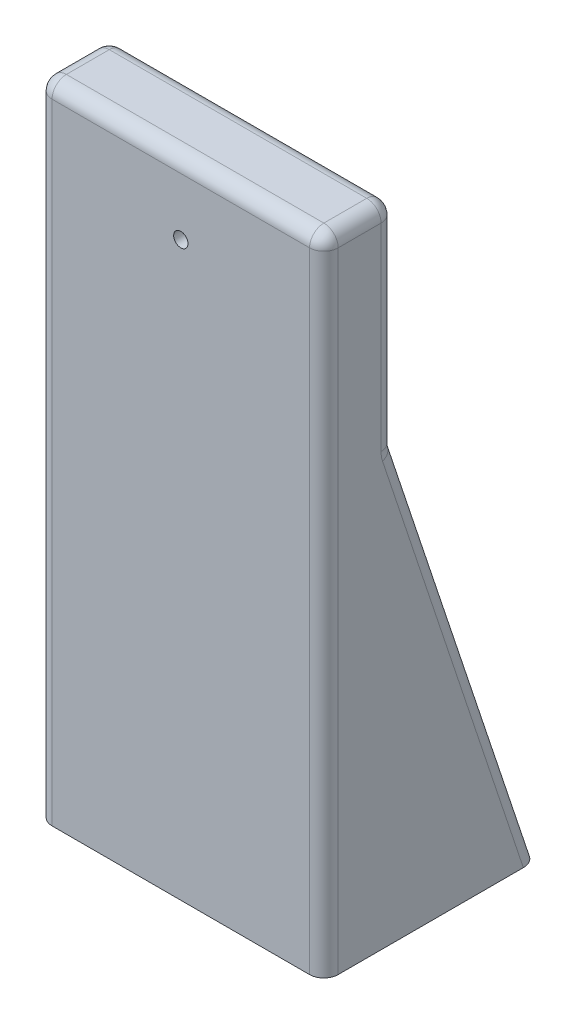
ISO-10303-21;
HEADER;
FILE_DESCRIPTION(('STEP AP214'),'2;1');
FILE_NAME('part.step','',(''),(''),'','','');
FILE_SCHEMA(('AUTOMOTIVE_DESIGN { 1 0 10303 214 1 1 1 1 }'));
ENDSEC;
DATA;
#1=APPLICATION_CONTEXT('core data for automotive mechanical design processes');
#2=APPLICATION_PROTOCOL_DEFINITION('international standard','automotive_design',2000,#1);
#3=PRODUCT_CONTEXT('',#1,'mechanical');
#4=PRODUCT('Part','Part','',(#3));
#5=PRODUCT_RELATED_PRODUCT_CATEGORY('part','',(#4));
#6=PRODUCT_DEFINITION_FORMATION('','',#4);
#7=PRODUCT_DEFINITION_CONTEXT('part definition',#1,'design');
#8=PRODUCT_DEFINITION('design','',#6,#7);
#9=PRODUCT_DEFINITION_SHAPE('','',#8);
#10=(LENGTH_UNIT() NAMED_UNIT(*) SI_UNIT(.MILLI.,.METRE.));
#11=(NAMED_UNIT(*) PLANE_ANGLE_UNIT() SI_UNIT($,.RADIAN.));
#12=(NAMED_UNIT(*) SI_UNIT($,.STERADIAN.) SOLID_ANGLE_UNIT());
#13=UNCERTAINTY_MEASURE_WITH_UNIT(LENGTH_MEASURE(1.E-05),#10,'distance_accuracy_value','');
#14=(GEOMETRIC_REPRESENTATION_CONTEXT(3) GLOBAL_UNCERTAINTY_ASSIGNED_CONTEXT((#13)) GLOBAL_UNIT_ASSIGNED_CONTEXT((#10,
#11,#12)) REPRESENTATION_CONTEXT('',''));
#15=CARTESIAN_POINT('',(0.,0.,0.));
#16=DIRECTION('',(0.,0.,1.));
#17=DIRECTION('',(1.,0.,0.));
#18=AXIS2_PLACEMENT_3D('',#15,#16,#17);
#19=CARTESIAN_POINT('',(0.,0.,6.35));
#20=DIRECTION('',(0.,0.,-1.));
#21=DIRECTION('',(-1.,0.,0.));
#22=AXIS2_PLACEMENT_3D('',#19,#20,#21);
#23=PLANE('',#22);
#24=DIRECTION('',(-1.,0.,0.));
#25=VECTOR('',#24,1.);
#26=CARTESIAN_POINT('',(0.,54.61,6.35));
#27=LINE('',#26,#25);
#28=CARTESIAN_POINT('',(22.86,54.61,6.35));
#29=VERTEX_POINT('',#28);
#30=CARTESIAN_POINT('',(-22.86,54.61,6.35));
#31=VERTEX_POINT('',#30);
#32=EDGE_CURVE('E228',#29,#31,#27,.T.);
#33=ORIENTED_EDGE('',*,*,#32,.T.);
#34=DIRECTION('',(0.,-1.,0.));
#35=VECTOR('',#34,1.);
#36=CARTESIAN_POINT('',(-22.86,0.,6.35));
#37=LINE('',#36,#35);
#38=CARTESIAN_POINT('',(-22.86,-57.15,6.35));
#39=VERTEX_POINT('',#38);
#40=EDGE_CURVE('E231',#31,#39,#37,.T.);
#41=ORIENTED_EDGE('',*,*,#40,.T.);
#42=DIRECTION('',(1.,0.,0.));
#43=VECTOR('',#42,1.);
#44=CARTESIAN_POINT('',(-25.4,-57.15,6.35));
#45=LINE('',#44,#43);
#46=CARTESIAN_POINT('',(22.86,-57.15,6.35));
#47=VERTEX_POINT('',#46);
#48=EDGE_CURVE('E360',#39,#47,#45,.T.);
#49=ORIENTED_EDGE('',*,*,#48,.T.);
#50=DIRECTION('',(0.,1.,0.));
#51=VECTOR('',#50,1.);
#52=CARTESIAN_POINT('',(22.86,0.,6.35));
#53=LINE('',#52,#51);
#54=EDGE_CURVE('E225',#47,#29,#53,.T.);
#55=ORIENTED_EDGE('',*,*,#54,.T.);
#56=EDGE_LOOP('',(#33,#41,#49,#55));
#57=FACE_BOUND('',#56,.T.);
#58=CARTESIAN_POINT('',(0.,44.45,6.35));
#59=DIRECTION('',(0.,0.,1.));
#60=DIRECTION('',(1.,0.,0.));
#61=AXIS2_PLACEMENT_3D('',#58,#59,#60);
#62=CIRCLE('',#61,1.27);
#63=CARTESIAN_POINT('',(1.27,44.45,6.35));
#64=VERTEX_POINT('',#63);
#65=EDGE_CURVE('E356',#64,#64,#62,.T.);
#66=ORIENTED_EDGE('',*,*,#65,.F.);
#67=EDGE_LOOP('',(#66));
#68=FACE_BOUND('',#67,.T.);
#69=ADVANCED_FACE('F45',(#57,#68),#23,.F.);
#70=CARTESIAN_POINT('',(0.,0.,-6.35));
#71=DIRECTION('',(0.,0.,-1.));
#72=DIRECTION('',(-1.,0.,0.));
#73=AXIS2_PLACEMENT_3D('',#70,#71,#72);
#74=PLANE('',#73);
#75=DIRECTION('',(1.,0.,0.));
#76=VECTOR('',#75,1.);
#77=CARTESIAN_POINT('',(-25.4,19.4621852568277,-6.35));
#78=LINE('',#77,#76);
#79=CARTESIAN_POINT('',(22.86,19.4621852568277,-6.35));
#80=VERTEX_POINT('',#79);
#81=CARTESIAN_POINT('',(-22.86,19.4621852568277,-6.35));
#82=VERTEX_POINT('',#81);
#83=EDGE_CURVE('E247',#80,#82,#78,.F.);
#84=ORIENTED_EDGE('',*,*,#83,.T.);
#85=DIRECTION('',(0.,-1.,0.));
#86=VECTOR('',#85,1.);
#87=CARTESIAN_POINT('',(-22.86,57.15,-6.35));
#88=LINE('',#87,#86);
#89=CARTESIAN_POINT('',(-22.86,54.61,-6.35));
#90=VERTEX_POINT('',#89);
#91=EDGE_CURVE('E11',#82,#90,#88,.F.);
#92=ORIENTED_EDGE('',*,*,#91,.T.);
#93=DIRECTION('',(-1.,0.,0.));
#94=VECTOR('',#93,1.);
#95=CARTESIAN_POINT('',(25.4,54.61,-6.35));
#96=LINE('',#95,#94);
#97=CARTESIAN_POINT('',(22.86,54.61,-6.35));
#98=VERTEX_POINT('',#97);
#99=EDGE_CURVE('E55',#90,#98,#96,.F.);
#100=ORIENTED_EDGE('',*,*,#99,.T.);
#101=DIRECTION('',(0.,1.,0.));
#102=VECTOR('',#101,1.);
#103=CARTESIAN_POINT('',(22.86,19.05,-6.35));
#104=LINE('',#103,#102);
#105=EDGE_CURVE('E250',#98,#80,#104,.F.);
#106=ORIENTED_EDGE('',*,*,#105,.T.);
#107=EDGE_LOOP('',(#84,#92,#100,#106));
#108=FACE_BOUND('',#107,.T.);
#109=CARTESIAN_POINT('',(0.,44.45,-6.35));
#110=DIRECTION('',(0.,0.,1.));
#111=DIRECTION('',(1.,0.,0.));
#112=AXIS2_PLACEMENT_3D('',#109,#110,#111);
#113=CIRCLE('',#112,1.27);
#114=CARTESIAN_POINT('',(1.27,44.45,-6.35));
#115=VERTEX_POINT('',#114);
#116=EDGE_CURVE('E172',#115,#115,#113,.T.);
#117=ORIENTED_EDGE('',*,*,#116,.T.);
#118=EDGE_LOOP('',(#117));
#119=FACE_BOUND('',#118,.T.);
#120=ADVANCED_FACE('F385',(#108,#119),#74,.T.);
#121=CARTESIAN_POINT('',(25.4,-57.15,6.35));
#122=DIRECTION('',(-1.,0.,0.));
#123=DIRECTION('',(0.,0.,1.));
#124=AXIS2_PLACEMENT_3D('',#121,#122,#123);
#125=PLANE('',#124);
#126=DIRECTION('',(0.,0.,-1.));
#127=VECTOR('',#126,1.);
#128=CARTESIAN_POINT('',(25.4,54.61,6.35));
#129=LINE('',#128,#127);
#130=CARTESIAN_POINT('',(25.4,54.61,-3.81));
#131=VERTEX_POINT('',#130);
#132=CARTESIAN_POINT('',(25.4,54.61,3.81));
#133=VERTEX_POINT('',#132);
#134=EDGE_CURVE('E212',#131,#133,#129,.F.);
#135=ORIENTED_EDGE('',*,*,#134,.T.);
#136=DIRECTION('',(0.,1.,0.));
#137=VECTOR('',#136,1.);
#138=CARTESIAN_POINT('',(25.4,-57.15,3.81));
#139=LINE('',#138,#137);
#140=CARTESIAN_POINT('',(25.4,-57.15,3.81));
#141=VERTEX_POINT('',#140);
#142=EDGE_CURVE('E222',#133,#141,#139,.F.);
#143=ORIENTED_EDGE('',*,*,#142,.T.);
#144=DIRECTION('',(0.,0.,-1.));
#145=VECTOR('',#144,1.);
#146=CARTESIAN_POINT('',(25.4,-57.15,6.35));
#147=LINE('',#146,#145);
#148=CARTESIAN_POINT('',(25.4,-57.15,-29.0726049143908));
#149=VERTEX_POINT('',#148);
#150=EDGE_CURVE('E367',#141,#149,#147,.T.);
#151=ORIENTED_EDGE('',*,*,#150,.T.);
#152=DIRECTION('',(0.,0.948683298050514,0.316227766016838));
#153=VECTOR('',#152,1.);
#154=CARTESIAN_POINT('',(25.4,18.2467814743172,-3.94034442295169));
#155=LINE('',#154,#153);
#156=CARTESIAN_POINT('',(25.4,17.8557482054622,-4.07068884590338));
#157=VERTEX_POINT('',#156);
#158=EDGE_CURVE('E219',#149,#157,#155,.T.);
#159=ORIENTED_EDGE('',*,*,#158,.T.);
#160=CARTESIAN_POINT('',(25.4,19.4621852568277,-8.89));
#161=DIRECTION('',(-1.,0.,0.));
#162=DIRECTION('',(0.,0.,1.));
#163=AXIS2_PLACEMENT_3D('',#160,#161,#162);
#164=CIRCLE('',#163,5.08);
#165=CARTESIAN_POINT('',(25.4,19.4621852568277,-3.81));
#166=VERTEX_POINT('',#165);
#167=EDGE_CURVE('E215',#166,#157,#164,.F.);
#168=ORIENTED_EDGE('',*,*,#167,.F.);
#169=DIRECTION('',(0.,1.,0.));
#170=VECTOR('',#169,1.);
#171=CARTESIAN_POINT('',(25.4,57.15,-3.81));
#172=LINE('',#171,#170);
#173=EDGE_CURVE('E162',#166,#131,#172,.T.);
#174=ORIENTED_EDGE('',*,*,#173,.T.);
#175=EDGE_LOOP('',(#135,#143,#151,#159,#168,#174));
#176=FACE_BOUND('',#175,.T.);
#177=ADVANCED_FACE('F417',(#176),#125,.F.);
#178=CARTESIAN_POINT('',(-25.4,57.15,6.35));
#179=DIRECTION('',(0.,-1.,0.));
#180=DIRECTION('',(0.,0.,-1.));
#181=AXIS2_PLACEMENT_3D('',#178,#179,#180);
#182=PLANE('',#181);
#183=DIRECTION('',(0.,0.,-1.));
#184=VECTOR('',#183,1.);
#185=CARTESIAN_POINT('',(-22.86,57.15,6.35));
#186=LINE('',#185,#184);
#187=CARTESIAN_POINT('',(-22.86,57.15,-3.81));
#188=VERTEX_POINT('',#187);
#189=CARTESIAN_POINT('',(-22.86,57.15,3.81));
#190=VERTEX_POINT('',#189);
#191=EDGE_CURVE('E240',#188,#190,#186,.F.);
#192=ORIENTED_EDGE('',*,*,#191,.T.);
#193=DIRECTION('',(-1.,0.,0.));
#194=VECTOR('',#193,1.);
#195=CARTESIAN_POINT('',(-25.4,57.15,3.81));
#196=LINE('',#195,#194);
#197=CARTESIAN_POINT('',(22.86,57.15,3.81));
#198=VERTEX_POINT('',#197);
#199=EDGE_CURVE('E244',#190,#198,#196,.F.);
#200=ORIENTED_EDGE('',*,*,#199,.T.);
#201=DIRECTION('',(0.,0.,-1.));
#202=VECTOR('',#201,1.);
#203=CARTESIAN_POINT('',(22.86,57.15,6.35));
#204=LINE('',#203,#202);
#205=CARTESIAN_POINT('',(22.86,57.15,-3.81));
#206=VERTEX_POINT('',#205);
#207=EDGE_CURVE('E237',#198,#206,#204,.T.);
#208=ORIENTED_EDGE('',*,*,#207,.T.);
#209=DIRECTION('',(-1.,0.,0.));
#210=VECTOR('',#209,1.);
#211=CARTESIAN_POINT('',(-25.4,57.15,-3.81));
#212=LINE('',#211,#210);
#213=EDGE_CURVE('E234',#206,#188,#212,.T.);
#214=ORIENTED_EDGE('',*,*,#213,.T.);
#215=EDGE_LOOP('',(#192,#200,#208,#214));
#216=FACE_BOUND('',#215,.T.);
#217=ADVANCED_FACE('F421',(#216),#182,.F.);
#218=CARTESIAN_POINT('',(-25.4,-57.15,6.35));
#219=DIRECTION('',(1.,0.,0.));
#220=DIRECTION('',(0.,0.,-1.));
#221=AXIS2_PLACEMENT_3D('',#218,#219,#220);
#222=PLANE('',#221);
#223=CARTESIAN_POINT('',(-25.4,19.4621852568277,-8.89));
#224=DIRECTION('',(1.,0.,0.));
#225=DIRECTION('',(0.,0.,-1.));
#226=AXIS2_PLACEMENT_3D('',#223,#224,#225);
#227=CIRCLE('',#226,5.08);
#228=CARTESIAN_POINT('',(-25.4,17.8557482054622,-4.07068884590339));
#229=VERTEX_POINT('',#228);
#230=CARTESIAN_POINT('',(-25.4,19.4621852568277,-3.81));
#231=VERTEX_POINT('',#230);
#232=EDGE_CURVE('E180',#229,#231,#227,.F.);
#233=ORIENTED_EDGE('',*,*,#232,.F.);
#234=DIRECTION('',(0.,0.948683298050514,0.316227766016838));
#235=VECTOR('',#234,1.);
#236=CARTESIAN_POINT('',(-25.4,-57.9532185256828,-29.3403444229517));
#237=LINE('',#236,#235);
#238=CARTESIAN_POINT('',(-25.4,-57.15,-29.0726049143908));
#239=VERTEX_POINT('',#238);
#240=EDGE_CURVE('E199',#229,#239,#237,.F.);
#241=ORIENTED_EDGE('',*,*,#240,.T.);
#242=DIRECTION('',(0.,0.,-1.));
#243=VECTOR('',#242,1.);
#244=CARTESIAN_POINT('',(-25.4,-57.15,6.35));
#245=LINE('',#244,#243);
#246=CARTESIAN_POINT('',(-25.4,-57.15,3.81));
#247=VERTEX_POINT('',#246);
#248=EDGE_CURVE('E157',#247,#239,#245,.T.);
#249=ORIENTED_EDGE('',*,*,#248,.F.);
#250=DIRECTION('',(0.,-1.,0.));
#251=VECTOR('',#250,1.);
#252=CARTESIAN_POINT('',(-25.4,-57.15,3.81));
#253=LINE('',#252,#251);
#254=CARTESIAN_POINT('',(-25.4,54.61,3.81));
#255=VERTEX_POINT('',#254);
#256=EDGE_CURVE('E196',#247,#255,#253,.F.);
#257=ORIENTED_EDGE('',*,*,#256,.T.);
#258=DIRECTION('',(0.,0.,-1.));
#259=VECTOR('',#258,1.);
#260=CARTESIAN_POINT('',(-25.4,54.61,6.35));
#261=LINE('',#260,#259);
#262=CARTESIAN_POINT('',(-25.4,54.61,-3.81));
#263=VERTEX_POINT('',#262);
#264=EDGE_CURVE('E193',#255,#263,#261,.T.);
#265=ORIENTED_EDGE('',*,*,#264,.T.);
#266=DIRECTION('',(0.,-1.,0.));
#267=VECTOR('',#266,1.);
#268=CARTESIAN_POINT('',(-25.4,19.05,-3.81));
#269=LINE('',#268,#267);
#270=EDGE_CURVE('E185',#263,#231,#269,.T.);
#271=ORIENTED_EDGE('',*,*,#270,.T.);
#272=EDGE_LOOP('',(#233,#241,#249,#257,#265,#271));
#273=FACE_BOUND('',#272,.T.);
#274=ADVANCED_FACE('F394',(#273),#222,.F.);
#275=CARTESIAN_POINT('',(-25.4,-57.15,6.35));
#276=DIRECTION('',(0.,1.,0.));
#277=DIRECTION('',(0.,0.,1.));
#278=AXIS2_PLACEMENT_3D('',#275,#276,#277);
#279=PLANE('',#278);
#280=CARTESIAN_POINT('',(15.24,-57.15,0.));
#281=DIRECTION('',(0.,-1.,0.));
#282=DIRECTION('',(0.,0.,-1.));
#283=AXIS2_PLACEMENT_3D('',#280,#281,#282);
#284=CIRCLE('',#283,1.5);
#285=CARTESIAN_POINT('',(15.24,-57.15,-1.49999999999999));
#286=VERTEX_POINT('',#285);
#287=EDGE_CURVE('E334',#286,#286,#284,.T.);
#288=ORIENTED_EDGE('',*,*,#287,.F.);
#289=EDGE_LOOP('',(#288));
#290=FACE_BOUND('',#289,.T.);
#291=CARTESIAN_POINT('',(-15.24,-57.15,-22.86));
#292=DIRECTION('',(0.,-1.,0.));
#293=DIRECTION('',(0.,0.,-1.));
#294=AXIS2_PLACEMENT_3D('',#291,#292,#293);
#295=CIRCLE('',#294,1.5);
#296=CARTESIAN_POINT('',(-15.24,-57.15,-24.36));
#297=VERTEX_POINT('',#296);
#298=EDGE_CURVE('E343',#297,#297,#295,.T.);
#299=ORIENTED_EDGE('',*,*,#298,.F.);
#300=EDGE_LOOP('',(#299));
#301=FACE_BOUND('',#300,.T.);
#302=CARTESIAN_POINT('',(15.24,-57.15,-22.86));
#303=DIRECTION('',(0.,-1.,0.));
#304=DIRECTION('',(0.,0.,-1.));
#305=AXIS2_PLACEMENT_3D('',#302,#303,#304);
#306=CIRCLE('',#305,1.5);
#307=CARTESIAN_POINT('',(15.24,-57.15,-24.36));
#308=VERTEX_POINT('',#307);
#309=EDGE_CURVE('E325',#308,#308,#306,.T.);
#310=ORIENTED_EDGE('',*,*,#309,.F.);
#311=EDGE_LOOP('',(#310));
#312=FACE_BOUND('',#311,.T.);
#313=CARTESIAN_POINT('',(-15.24,-57.15,0.));
#314=DIRECTION('',(0.,-1.,0.));
#315=DIRECTION('',(0.,0.,-1.));
#316=AXIS2_PLACEMENT_3D('',#313,#314,#315);
#317=CIRCLE('',#316,1.5);
#318=CARTESIAN_POINT('',(-15.24,-57.15,-1.5));
#319=VERTEX_POINT('',#318);
#320=EDGE_CURVE('E338',#319,#319,#317,.T.);
#321=ORIENTED_EDGE('',*,*,#320,.F.);
#322=EDGE_LOOP('',(#321));
#323=FACE_BOUND('',#322,.T.);
#324=ORIENTED_EDGE('',*,*,#248,.T.);
#325=CARTESIAN_POINT('',(-22.86,-57.15,-29.0726049143908));
#326=DIRECTION('',(0.,1.,0.));
#327=DIRECTION('',(0.,0.,-1.));
#328=AXIS2_PLACEMENT_3D('',#325,#326,#327);
#329=ELLIPSE('',#328,2.67739508560923,2.54);
#330=CARTESIAN_POINT('',(-22.86,-57.15,-31.75));
#331=VERTEX_POINT('',#330);
#332=EDGE_CURVE('E151',#239,#331,#329,.F.);
#333=ORIENTED_EDGE('',*,*,#332,.T.);
#334=DIRECTION('',(1.,0.,0.));
#335=VECTOR('',#334,1.);
#336=CARTESIAN_POINT('',(-25.4,-57.15,-31.75));
#337=LINE('',#336,#335);
#338=CARTESIAN_POINT('',(22.86,-57.15,-31.75));
#339=VERTEX_POINT('',#338);
#340=EDGE_CURVE('E154',#331,#339,#337,.T.);
#341=ORIENTED_EDGE('',*,*,#340,.T.);
#342=CARTESIAN_POINT('',(22.86,-57.15,-29.0726049143908));
#343=DIRECTION('',(0.,1.,0.));
#344=DIRECTION('',(0.,0.,-1.));
#345=AXIS2_PLACEMENT_3D('',#342,#343,#344);
#346=ELLIPSE('',#345,2.67739508560923,2.54);
#347=EDGE_CURVE('E163',#339,#149,#346,.F.);
#348=ORIENTED_EDGE('',*,*,#347,.T.);
#349=ORIENTED_EDGE('',*,*,#150,.F.);
#350=CARTESIAN_POINT('',(22.86,-57.15,3.81));
#351=DIRECTION('',(0.,1.,0.));
#352=DIRECTION('',(0.,0.,1.));
#353=AXIS2_PLACEMENT_3D('',#350,#351,#352);
#354=CIRCLE('',#353,2.54);
#355=EDGE_CURVE('E202',#141,#47,#354,.F.);
#356=ORIENTED_EDGE('',*,*,#355,.T.);
#357=ORIENTED_EDGE('',*,*,#48,.F.);
#358=CARTESIAN_POINT('',(-22.86,-57.15,3.81));
#359=DIRECTION('',(0.,1.,0.));
#360=DIRECTION('',(0.,0.,1.));
#361=AXIS2_PLACEMENT_3D('',#358,#359,#360);
#362=CIRCLE('',#361,2.54);
#363=EDGE_CURVE('E205',#39,#247,#362,.F.);
#364=ORIENTED_EDGE('',*,*,#363,.T.);
#365=EDGE_LOOP('',(#324,#333,#341,#348,#349,#356,#357,#364));
#366=FACE_BOUND('',#365,.T.);
#367=ADVANCED_FACE('F153',(#290,#301,#312,#323,#366),#279,.F.);
#368=CARTESIAN_POINT('',(0.,44.45,6.35));
#369=DIRECTION('',(0.,0.,-1.));
#370=DIRECTION('',(-1.,0.,0.));
#371=AXIS2_PLACEMENT_3D('',#368,#369,#370);
#372=CYLINDRICAL_SURFACE('',#371,1.27);
#373=ORIENTED_EDGE('',*,*,#65,.T.);
#374=EDGE_LOOP('',(#373));
#375=FACE_BOUND('',#374,.T.);
#376=ORIENTED_EDGE('',*,*,#116,.F.);
#377=EDGE_LOOP('',(#376));
#378=FACE_BOUND('',#377,.T.);
#379=ADVANCED_FACE('F446',(#375,#378),#372,.F.);
#380=CARTESIAN_POINT('',(-25.4,-57.15,-31.75));
#381=DIRECTION('',(0.,0.316227766016838,-0.948683298050514));
#382=DIRECTION('',(0.,0.948683298050514,0.316227766016838));
#383=AXIS2_PLACEMENT_3D('',#380,#381,#382);
#384=PLANE('',#383);
#385=ORIENTED_EDGE('',*,*,#340,.F.);
#386=DIRECTION('',(0.,0.948683298050514,0.316227766016838));
#387=VECTOR('',#386,1.);
#388=CARTESIAN_POINT('',(-22.86,19.05,-6.35));
#389=LINE('',#388,#387);
#390=CARTESIAN_POINT('',(-22.86,18.6589667311449,-6.4803444229517));
#391=VERTEX_POINT('',#390);
#392=EDGE_CURVE('E168',#331,#391,#389,.T.);
#393=ORIENTED_EDGE('',*,*,#392,.T.);
#394=DIRECTION('',(1.,0.,0.));
#395=VECTOR('',#394,1.);
#396=CARTESIAN_POINT('',(25.4,18.6589667311449,-6.48034442295169));
#397=LINE('',#396,#395);
#398=CARTESIAN_POINT('',(22.86,18.6589667311449,-6.4803444229517));
#399=VERTEX_POINT('',#398);
#400=EDGE_CURVE('E187',#391,#399,#397,.T.);
#401=ORIENTED_EDGE('',*,*,#400,.T.);
#402=DIRECTION('',(0.,0.948683298050514,0.316227766016838));
#403=VECTOR('',#402,1.);
#404=CARTESIAN_POINT('',(22.86,-57.15,-31.75));
#405=LINE('',#404,#403);
#406=EDGE_CURVE('E170',#399,#339,#405,.F.);
#407=ORIENTED_EDGE('',*,*,#406,.T.);
#408=EDGE_LOOP('',(#385,#393,#401,#407));
#409=FACE_BOUND('',#408,.T.);
#410=ADVANCED_FACE('F167',(#409),#384,.T.);
#411=CARTESIAN_POINT('',(-15.24,-44.45,0.));
#412=DIRECTION('',(0.,-1.,0.));
#413=DIRECTION('',(0.,0.,-1.));
#414=AXIS2_PLACEMENT_3D('',#411,#412,#413);
#415=CYLINDRICAL_SURFACE('',#414,1.5);
#416=CARTESIAN_POINT('',(-15.24,-44.45,0.));
#417=DIRECTION('',(0.,-1.,0.));
#418=DIRECTION('',(0.,0.,-1.));
#419=AXIS2_PLACEMENT_3D('',#416,#417,#418);
#420=CIRCLE('',#419,1.5);
#421=CARTESIAN_POINT('',(-15.24,-44.45,-1.5));
#422=VERTEX_POINT('',#421);
#423=EDGE_CURVE('E173',#422,#422,#420,.T.);
#424=ORIENTED_EDGE('',*,*,#423,.F.);
#425=EDGE_LOOP('',(#424));
#426=FACE_BOUND('',#425,.T.);
#427=ORIENTED_EDGE('',*,*,#320,.T.);
#428=EDGE_LOOP('',(#427));
#429=FACE_BOUND('',#428,.T.);
#430=ADVANCED_FACE('F645',(#426,#429),#415,.F.);
#431=CARTESIAN_POINT('',(-15.24,-44.45,0.));
#432=DIRECTION('',(0.,-1.,0.));
#433=DIRECTION('',(0.,0.,-1.));
#434=AXIS2_PLACEMENT_3D('',#431,#432,#433);
#435=PLANE('',#434);
#436=ORIENTED_EDGE('',*,*,#423,.T.);
#437=EDGE_LOOP('',(#436));
#438=FACE_BOUND('',#437,.T.);
#439=ADVANCED_FACE('F636',(#438),#435,.T.);
#440=CARTESIAN_POINT('',(15.24,-44.45,-22.86));
#441=DIRECTION('',(0.,-1.,0.));
#442=DIRECTION('',(0.,0.,-1.));
#443=AXIS2_PLACEMENT_3D('',#440,#441,#442);
#444=CYLINDRICAL_SURFACE('',#443,1.5);
#445=CARTESIAN_POINT('',(15.24,-44.45,-22.86));
#446=DIRECTION('',(0.,-1.,0.));
#447=DIRECTION('',(0.,0.,-1.));
#448=AXIS2_PLACEMENT_3D('',#445,#446,#447);
#449=CIRCLE('',#448,1.5);
#450=CARTESIAN_POINT('',(15.24,-44.45,-24.36));
#451=VERTEX_POINT('',#450);
#452=EDGE_CURVE('E319',#451,#451,#449,.T.);
#453=ORIENTED_EDGE('',*,*,#452,.F.);
#454=EDGE_LOOP('',(#453));
#455=FACE_BOUND('',#454,.T.);
#456=ORIENTED_EDGE('',*,*,#309,.T.);
#457=EDGE_LOOP('',(#456));
#458=FACE_BOUND('',#457,.T.);
#459=ADVANCED_FACE('F628',(#455,#458),#444,.F.);
#460=CARTESIAN_POINT('',(15.24,-44.45,-22.86));
#461=DIRECTION('',(0.,-1.,0.));
#462=DIRECTION('',(0.,0.,-1.));
#463=AXIS2_PLACEMENT_3D('',#460,#461,#462);
#464=PLANE('',#463);
#465=ORIENTED_EDGE('',*,*,#452,.T.);
#466=EDGE_LOOP('',(#465));
#467=FACE_BOUND('',#466,.T.);
#468=ADVANCED_FACE('F619',(#467),#464,.T.);
#469=CARTESIAN_POINT('',(-15.24,-44.45,-22.86));
#470=DIRECTION('',(0.,-1.,0.));
#471=DIRECTION('',(0.,0.,-1.));
#472=AXIS2_PLACEMENT_3D('',#469,#470,#471);
#473=CYLINDRICAL_SURFACE('',#472,1.5);
#474=CARTESIAN_POINT('',(-15.24,-44.45,-22.86));
#475=DIRECTION('',(0.,-1.,0.));
#476=DIRECTION('',(0.,0.,-1.));
#477=AXIS2_PLACEMENT_3D('',#474,#475,#476);
#478=CIRCLE('',#477,1.5);
#479=CARTESIAN_POINT('',(-15.24,-44.45,-24.36));
#480=VERTEX_POINT('',#479);
#481=EDGE_CURVE('E331',#480,#480,#478,.T.);
#482=ORIENTED_EDGE('',*,*,#481,.F.);
#483=EDGE_LOOP('',(#482));
#484=FACE_BOUND('',#483,.T.);
#485=ORIENTED_EDGE('',*,*,#298,.T.);
#486=EDGE_LOOP('',(#485));
#487=FACE_BOUND('',#486,.T.);
#488=ADVANCED_FACE('F610',(#484,#487),#473,.F.);
#489=CARTESIAN_POINT('',(-15.24,-44.45,-22.86));
#490=DIRECTION('',(0.,-1.,0.));
#491=DIRECTION('',(0.,0.,-1.));
#492=AXIS2_PLACEMENT_3D('',#489,#490,#491);
#493=PLANE('',#492);
#494=ORIENTED_EDGE('',*,*,#481,.T.);
#495=EDGE_LOOP('',(#494));
#496=FACE_BOUND('',#495,.T.);
#497=ADVANCED_FACE('F601',(#496),#493,.T.);
#498=CARTESIAN_POINT('',(15.24,-44.45,0.));
#499=DIRECTION('',(0.,-1.,0.));
#500=DIRECTION('',(0.,0.,-1.));
#501=AXIS2_PLACEMENT_3D('',#498,#499,#500);
#502=CYLINDRICAL_SURFACE('',#501,1.5);
#503=CARTESIAN_POINT('',(15.24,-44.45,0.));
#504=DIRECTION('',(0.,-1.,0.));
#505=DIRECTION('',(0.,0.,-1.));
#506=AXIS2_PLACEMENT_3D('',#503,#504,#505);
#507=CIRCLE('',#506,1.5);
#508=CARTESIAN_POINT('',(15.24,-44.45,-1.49999999999999));
#509=VERTEX_POINT('',#508);
#510=EDGE_CURVE('E339',#509,#509,#507,.T.);
#511=ORIENTED_EDGE('',*,*,#510,.F.);
#512=EDGE_LOOP('',(#511));
#513=FACE_BOUND('',#512,.T.);
#514=ORIENTED_EDGE('',*,*,#287,.T.);
#515=EDGE_LOOP('',(#514));
#516=FACE_BOUND('',#515,.T.);
#517=ADVANCED_FACE('F592',(#513,#516),#502,.F.);
#518=CARTESIAN_POINT('',(15.24,-44.45,0.));
#519=DIRECTION('',(0.,-1.,0.));
#520=DIRECTION('',(0.,0.,-1.));
#521=AXIS2_PLACEMENT_3D('',#518,#519,#520);
#522=PLANE('',#521);
#523=ORIENTED_EDGE('',*,*,#510,.T.);
#524=EDGE_LOOP('',(#523));
#525=FACE_BOUND('',#524,.T.);
#526=ADVANCED_FACE('F434',(#525),#522,.T.);
#527=CARTESIAN_POINT('',(22.86,0.,3.81));
#528=DIRECTION('',(0.,1.,0.));
#529=DIRECTION('',(0.,0.,1.));
#530=AXIS2_PLACEMENT_3D('',#527,#528,#529);
#531=CYLINDRICAL_SURFACE('',#530,2.54);
#532=CARTESIAN_POINT('',(22.86,54.61,3.81));
#533=DIRECTION('',(0.,1.,0.));
#534=DIRECTION('',(0.,0.,1.));
#535=AXIS2_PLACEMENT_3D('',#532,#533,#534);
#536=CIRCLE('',#535,2.54);
#537=EDGE_CURVE('E49',#29,#133,#536,.T.);
#538=ORIENTED_EDGE('',*,*,#537,.F.);
#539=ORIENTED_EDGE('',*,*,#54,.F.);
#540=ORIENTED_EDGE('',*,*,#355,.F.);
#541=ORIENTED_EDGE('',*,*,#142,.F.);
#542=EDGE_LOOP('',(#538,#539,#540,#541));
#543=FACE_BOUND('',#542,.T.);
#544=ADVANCED_FACE('F47',(#543),#531,.T.);
#545=CARTESIAN_POINT('',(22.86,54.61,3.81));
#546=DIRECTION('',(1.,0.,0.));
#547=DIRECTION('',(0.,0.,-1.));
#548=AXIS2_PLACEMENT_3D('',#545,#546,#547);
#549=SPHERICAL_SURFACE('',#548,2.54);
#550=CARTESIAN_POINT('',(22.86,54.61,3.81));
#551=DIRECTION('',(1.,0.,0.));
#552=DIRECTION('',(0.,0.,-1.));
#553=AXIS2_PLACEMENT_3D('',#550,#551,#552);
#554=CIRCLE('',#553,2.54);
#555=EDGE_CURVE('E307',#29,#198,#554,.F.);
#556=ORIENTED_EDGE('',*,*,#555,.F.);
#557=ORIENTED_EDGE('',*,*,#537,.T.);
#558=CARTESIAN_POINT('',(22.86,54.61,3.81));
#559=DIRECTION('',(0.,0.,1.));
#560=DIRECTION('',(1.,0.,0.));
#561=AXIS2_PLACEMENT_3D('',#558,#559,#560);
#562=CIRCLE('',#561,2.54);
#563=EDGE_CURVE('E310',#198,#133,#562,.F.);
#564=ORIENTED_EDGE('',*,*,#563,.F.);
#565=EDGE_LOOP('',(#556,#557,#564));
#566=FACE_BOUND('',#565,.T.);
#567=ADVANCED_FACE('F427',(#566),#549,.T.);
#568=CARTESIAN_POINT('',(22.86,54.61,6.35));
#569=DIRECTION('',(0.,0.,-1.));
#570=DIRECTION('',(-1.,0.,0.));
#571=AXIS2_PLACEMENT_3D('',#568,#569,#570);
#572=CYLINDRICAL_SURFACE('',#571,2.54);
#573=ORIENTED_EDGE('',*,*,#563,.T.);
#574=ORIENTED_EDGE('',*,*,#134,.F.);
#575=CARTESIAN_POINT('',(22.86,54.61,-3.81));
#576=DIRECTION('',(0.,0.,-1.));
#577=DIRECTION('',(-1.,0.,0.));
#578=AXIS2_PLACEMENT_3D('',#575,#576,#577);
#579=CIRCLE('',#578,2.54);
#580=EDGE_CURVE('E303',#206,#131,#579,.T.);
#581=ORIENTED_EDGE('',*,*,#580,.F.);
#582=ORIENTED_EDGE('',*,*,#207,.F.);
#583=EDGE_LOOP('',(#573,#574,#581,#582));
#584=FACE_BOUND('',#583,.T.);
#585=ADVANCED_FACE('F419',(#584),#572,.T.);
#586=CARTESIAN_POINT('',(0.,54.61,3.81));
#587=DIRECTION('',(-1.,0.,0.));
#588=DIRECTION('',(0.,0.,1.));
#589=AXIS2_PLACEMENT_3D('',#586,#587,#588);
#590=CYLINDRICAL_SURFACE('',#589,2.54);
#591=ORIENTED_EDGE('',*,*,#555,.T.);
#592=ORIENTED_EDGE('',*,*,#199,.F.);
#593=CARTESIAN_POINT('',(-22.86,54.61,3.81));
#594=DIRECTION('',(-1.,0.,0.));
#595=DIRECTION('',(0.,0.,1.));
#596=AXIS2_PLACEMENT_3D('',#593,#594,#595);
#597=CIRCLE('',#596,2.54);
#598=EDGE_CURVE('E299',#31,#190,#597,.T.);
#599=ORIENTED_EDGE('',*,*,#598,.F.);
#600=ORIENTED_EDGE('',*,*,#32,.F.);
#601=EDGE_LOOP('',(#591,#592,#599,#600));
#602=FACE_BOUND('',#601,.T.);
#603=ADVANCED_FACE('F426',(#602),#590,.T.);
#604=CARTESIAN_POINT('',(-22.86,0.,3.81));
#605=DIRECTION('',(0.,-1.,0.));
#606=DIRECTION('',(0.,0.,-1.));
#607=AXIS2_PLACEMENT_3D('',#604,#605,#606);
#608=CYLINDRICAL_SURFACE('',#607,2.54);
#609=ORIENTED_EDGE('',*,*,#363,.F.);
#610=ORIENTED_EDGE('',*,*,#40,.F.);
#611=CARTESIAN_POINT('',(-22.86,54.61,3.81));
#612=DIRECTION('',(0.,1.,0.));
#613=DIRECTION('',(0.,0.,1.));
#614=AXIS2_PLACEMENT_3D('',#611,#612,#613);
#615=CIRCLE('',#614,2.54);
#616=EDGE_CURVE('E295',#255,#31,#615,.T.);
#617=ORIENTED_EDGE('',*,*,#616,.F.);
#618=ORIENTED_EDGE('',*,*,#256,.F.);
#619=EDGE_LOOP('',(#609,#610,#617,#618));
#620=FACE_BOUND('',#619,.T.);
#621=ADVANCED_FACE('F484',(#620),#608,.T.);
#622=CARTESIAN_POINT('',(22.86,54.61,-3.81));
#623=DIRECTION('',(1.,0.,0.));
#624=DIRECTION('',(0.,0.,-1.));
#625=AXIS2_PLACEMENT_3D('',#622,#623,#624);
#626=SPHERICAL_SURFACE('',#625,2.54);
#627=CARTESIAN_POINT('',(22.86,54.61,-3.81));
#628=DIRECTION('',(1.,0.,0.));
#629=DIRECTION('',(0.,0.,-1.));
#630=AXIS2_PLACEMENT_3D('',#627,#628,#629);
#631=CIRCLE('',#630,2.54);
#632=EDGE_CURVE('E288',#206,#98,#631,.F.);
#633=ORIENTED_EDGE('',*,*,#632,.F.);
#634=ORIENTED_EDGE('',*,*,#580,.T.);
#635=CARTESIAN_POINT('',(22.86,54.61,-3.81));
#636=DIRECTION('',(0.,1.,0.));
#637=DIRECTION('',(0.,0.,1.));
#638=AXIS2_PLACEMENT_3D('',#635,#636,#637);
#639=CIRCLE('',#638,2.54);
#640=EDGE_CURVE('E291',#98,#131,#639,.F.);
#641=ORIENTED_EDGE('',*,*,#640,.F.);
#642=EDGE_LOOP('',(#633,#634,#641));
#643=FACE_BOUND('',#642,.T.);
#644=ADVANCED_FACE('F411',(#643),#626,.T.);
#645=CARTESIAN_POINT('',(-22.86,54.61,3.81));
#646=DIRECTION('',(0.,0.,1.));
#647=DIRECTION('',(1.,0.,0.));
#648=AXIS2_PLACEMENT_3D('',#645,#646,#647);
#649=SPHERICAL_SURFACE('',#648,2.54);
#650=ORIENTED_EDGE('',*,*,#616,.T.);
#651=ORIENTED_EDGE('',*,*,#598,.T.);
#652=CARTESIAN_POINT('',(-22.86,54.61,3.81));
#653=DIRECTION('',(0.,0.,1.));
#654=DIRECTION('',(1.,0.,0.));
#655=AXIS2_PLACEMENT_3D('',#652,#653,#654);
#656=CIRCLE('',#655,2.54);
#657=EDGE_CURVE('E285',#255,#190,#656,.F.);
#658=ORIENTED_EDGE('',*,*,#657,.F.);
#659=EDGE_LOOP('',(#650,#651,#658));
#660=FACE_BOUND('',#659,.T.);
#661=ADVANCED_FACE('F478',(#660),#649,.T.);
#662=CARTESIAN_POINT('',(22.86,-46.5232185256828,-25.5303444229517));
#663=DIRECTION('',(0.,-0.948683298050514,-0.316227766016838));
#664=DIRECTION('',(0.,0.316227766016838,-0.948683298050514));
#665=AXIS2_PLACEMENT_3D('',#662,#663,#664);
#666=CYLINDRICAL_SURFACE('',#665,2.54);
#667=ORIENTED_EDGE('',*,*,#347,.F.);
#668=ORIENTED_EDGE('',*,*,#406,.F.);
#669=CARTESIAN_POINT('',(22.86,17.8557482054622,-4.07068884590338));
#670=DIRECTION('',(0.,0.948683298050514,0.316227766016839));
#671=DIRECTION('',(0.,-0.316227766016839,0.948683298050514));
#672=AXIS2_PLACEMENT_3D('',#669,#670,#671);
#673=CIRCLE('',#672,2.54);
#674=EDGE_CURVE('E281',#157,#399,#673,.T.);
#675=ORIENTED_EDGE('',*,*,#674,.F.);
#676=ORIENTED_EDGE('',*,*,#158,.F.);
#677=EDGE_LOOP('',(#667,#668,#675,#676));
#678=FACE_BOUND('',#677,.T.);
#679=ADVANCED_FACE('F378',(#678),#666,.T.);
#680=CARTESIAN_POINT('',(22.86,-57.15,-3.81));
#681=DIRECTION('',(0.,-1.,0.));
#682=DIRECTION('',(0.,0.,-1.));
#683=AXIS2_PLACEMENT_3D('',#680,#681,#682);
#684=CYLINDRICAL_SURFACE('',#683,2.54);
#685=ORIENTED_EDGE('',*,*,#640,.T.);
#686=ORIENTED_EDGE('',*,*,#173,.F.);
#687=CARTESIAN_POINT('',(22.86,19.4621852568277,-3.81));
#688=DIRECTION('',(0.,-1.,0.));
#689=DIRECTION('',(0.,0.,-1.));
#690=AXIS2_PLACEMENT_3D('',#687,#688,#689);
#691=CIRCLE('',#690,2.54);
#692=EDGE_CURVE('E277',#80,#166,#691,.T.);
#693=ORIENTED_EDGE('',*,*,#692,.F.);
#694=ORIENTED_EDGE('',*,*,#105,.F.);
#695=EDGE_LOOP('',(#685,#686,#693,#694));
#696=FACE_BOUND('',#695,.T.);
#697=ADVANCED_FACE('F415',(#696),#684,.T.);
#698=CARTESIAN_POINT('',(-25.4,54.61,-3.81));
#699=DIRECTION('',(1.,0.,0.));
#700=DIRECTION('',(0.,0.,-1.));
#701=AXIS2_PLACEMENT_3D('',#698,#699,#700);
#702=CYLINDRICAL_SURFACE('',#701,2.54);
#703=ORIENTED_EDGE('',*,*,#632,.T.);
#704=ORIENTED_EDGE('',*,*,#99,.F.);
#705=CARTESIAN_POINT('',(-22.86,54.61,-3.81));
#706=DIRECTION('',(-1.,0.,0.));
#707=DIRECTION('',(0.,0.,1.));
#708=AXIS2_PLACEMENT_3D('',#705,#706,#707);
#709=CIRCLE('',#708,2.54);
#710=EDGE_CURVE('E274',#188,#90,#709,.T.);
#711=ORIENTED_EDGE('',*,*,#710,.F.);
#712=ORIENTED_EDGE('',*,*,#213,.F.);
#713=EDGE_LOOP('',(#703,#704,#711,#712));
#714=FACE_BOUND('',#713,.T.);
#715=ADVANCED_FACE('F407',(#714),#702,.T.);
#716=CARTESIAN_POINT('',(-22.86,54.61,6.35));
#717=DIRECTION('',(0.,0.,-1.));
#718=DIRECTION('',(-1.,0.,0.));
#719=AXIS2_PLACEMENT_3D('',#716,#717,#718);
#720=CYLINDRICAL_SURFACE('',#719,2.54);
#721=ORIENTED_EDGE('',*,*,#657,.T.);
#722=ORIENTED_EDGE('',*,*,#191,.F.);
#723=CARTESIAN_POINT('',(-22.86,54.61,-3.81));
#724=DIRECTION('',(0.,0.,-1.));
#725=DIRECTION('',(-1.,0.,0.));
#726=AXIS2_PLACEMENT_3D('',#723,#724,#725);
#727=CIRCLE('',#726,2.54);
#728=EDGE_CURVE('E270',#263,#188,#727,.T.);
#729=ORIENTED_EDGE('',*,*,#728,.F.);
#730=ORIENTED_EDGE('',*,*,#264,.F.);
#731=EDGE_LOOP('',(#721,#722,#729,#730));
#732=FACE_BOUND('',#731,.T.);
#733=ADVANCED_FACE('F401',(#732),#720,.T.);
#734=CARTESIAN_POINT('',(22.86,19.4621852568277,-8.89));
#735=DIRECTION('',(-1.,0.,0.));
#736=DIRECTION('',(0.,0.,1.));
#737=AXIS2_PLACEMENT_3D('',#734,#735,#736);
#738=TOROIDAL_SURFACE('',#737,5.08,2.54);
#739=ORIENTED_EDGE('',*,*,#167,.T.);
#740=ORIENTED_EDGE('',*,*,#674,.T.);
#741=CARTESIAN_POINT('',(22.86,19.4621852568277,-8.89));
#742=DIRECTION('',(-1.,0.,0.));
#743=DIRECTION('',(0.,0.,1.));
#744=AXIS2_PLACEMENT_3D('',#741,#742,#743);
#745=CIRCLE('',#744,2.54);
#746=EDGE_CURVE('E266',#80,#399,#745,.F.);
#747=ORIENTED_EDGE('',*,*,#746,.F.);
#748=ORIENTED_EDGE('',*,*,#692,.T.);
#749=EDGE_LOOP('',(#739,#740,#747,#748));
#750=FACE_BOUND('',#749,.T.);
#751=ADVANCED_FACE('F382',(#750),#738,.T.);
#752=CARTESIAN_POINT('',(-22.86,54.61,-3.81));
#753=DIRECTION('',(0.,1.,0.));
#754=DIRECTION('',(0.,0.,1.));
#755=AXIS2_PLACEMENT_3D('',#752,#753,#754);
#756=SPHERICAL_SURFACE('',#755,2.54);
#757=ORIENTED_EDGE('',*,*,#728,.T.);
#758=ORIENTED_EDGE('',*,*,#710,.T.);
#759=CARTESIAN_POINT('',(-22.86,54.61,-3.81));
#760=DIRECTION('',(0.,1.,0.));
#761=DIRECTION('',(0.,0.,1.));
#762=AXIS2_PLACEMENT_3D('',#759,#760,#761);
#763=CIRCLE('',#762,2.54);
#764=EDGE_CURVE('E63',#263,#90,#763,.F.);
#765=ORIENTED_EDGE('',*,*,#764,.F.);
#766=EDGE_LOOP('',(#757,#758,#765));
#767=FACE_BOUND('',#766,.T.);
#768=ADVANCED_FACE('F404',(#767),#756,.T.);
#769=CARTESIAN_POINT('',(-25.4,19.4621852568277,-8.89));
#770=DIRECTION('',(-1.,0.,0.));
#771=DIRECTION('',(0.,0.,1.));
#772=AXIS2_PLACEMENT_3D('',#769,#770,#771);
#773=CYLINDRICAL_SURFACE('',#772,2.54);
#774=ORIENTED_EDGE('',*,*,#746,.T.);
#775=ORIENTED_EDGE('',*,*,#400,.F.);
#776=CARTESIAN_POINT('',(-22.86,19.4621852568277,-8.89));
#777=DIRECTION('',(1.,0.,0.));
#778=DIRECTION('',(0.,0.,-1.));
#779=AXIS2_PLACEMENT_3D('',#776,#777,#778);
#780=CIRCLE('',#779,2.54);
#781=EDGE_CURVE('E261',#82,#391,#780,.T.);
#782=ORIENTED_EDGE('',*,*,#781,.F.);
#783=ORIENTED_EDGE('',*,*,#83,.F.);
#784=EDGE_LOOP('',(#774,#775,#782,#783));
#785=FACE_BOUND('',#784,.T.);
#786=ADVANCED_FACE('F384',(#785),#773,.F.);
#787=CARTESIAN_POINT('',(-22.86,-57.15,-3.81));
#788=DIRECTION('',(0.,1.,0.));
#789=DIRECTION('',(0.,0.,1.));
#790=AXIS2_PLACEMENT_3D('',#787,#788,#789);
#791=CYLINDRICAL_SURFACE('',#790,2.54);
#792=ORIENTED_EDGE('',*,*,#764,.T.);
#793=ORIENTED_EDGE('',*,*,#91,.F.);
#794=CARTESIAN_POINT('',(-22.86,19.4621852568277,-3.81));
#795=DIRECTION('',(0.,-1.,0.));
#796=DIRECTION('',(0.,0.,-1.));
#797=AXIS2_PLACEMENT_3D('',#794,#795,#796);
#798=CIRCLE('',#797,2.54);
#799=EDGE_CURVE('E257',#231,#82,#798,.T.);
#800=ORIENTED_EDGE('',*,*,#799,.F.);
#801=ORIENTED_EDGE('',*,*,#270,.F.);
#802=EDGE_LOOP('',(#792,#793,#800,#801));
#803=FACE_BOUND('',#802,.T.);
#804=ADVANCED_FACE('F390',(#803),#791,.T.);
#805=CARTESIAN_POINT('',(-22.86,19.4621852568277,-8.89));
#806=DIRECTION('',(1.,0.,0.));
#807=DIRECTION('',(0.,0.,-1.));
#808=AXIS2_PLACEMENT_3D('',#805,#806,#807);
#809=TOROIDAL_SURFACE('',#808,5.08,2.54);
#810=ORIENTED_EDGE('',*,*,#799,.T.);
#811=ORIENTED_EDGE('',*,*,#781,.T.);
#812=CARTESIAN_POINT('',(-22.86,17.8557482054622,-4.07068884590339));
#813=DIRECTION('',(0.,0.948683298050514,0.316227766016838));
#814=DIRECTION('',(0.,-0.316227766016838,0.948683298050514));
#815=AXIS2_PLACEMENT_3D('',#812,#813,#814);
#816=CIRCLE('',#815,2.54);
#817=EDGE_CURVE('E177',#229,#391,#816,.F.);
#818=ORIENTED_EDGE('',*,*,#817,.F.);
#819=ORIENTED_EDGE('',*,*,#232,.T.);
#820=EDGE_LOOP('',(#810,#811,#818,#819));
#821=FACE_BOUND('',#820,.T.);
#822=ADVANCED_FACE('F392',(#821),#809,.T.);
#823=CARTESIAN_POINT('',(-22.86,-57.9532185256828,-29.3403444229517));
#824=DIRECTION('',(0.,-0.948683298050514,-0.316227766016838));
#825=DIRECTION('',(0.,0.316227766016838,-0.948683298050514));
#826=AXIS2_PLACEMENT_3D('',#823,#824,#825);
#827=CYLINDRICAL_SURFACE('',#826,2.54);
#828=ORIENTED_EDGE('',*,*,#332,.F.);
#829=ORIENTED_EDGE('',*,*,#240,.F.);
#830=ORIENTED_EDGE('',*,*,#817,.T.);
#831=ORIENTED_EDGE('',*,*,#392,.F.);
#832=EDGE_LOOP('',(#828,#829,#830,#831));
#833=FACE_BOUND('',#832,.T.);
#834=ADVANCED_FACE('F175',(#833),#827,.T.);
#835=CLOSED_SHELL('',(#69,#120,#177,#217,#274,#367,#379,#410,#430,#439,#459,#468,#488,#497,#517,
#526,#544,#567,#585,#603,#621,#644,#661,#679,#697,#715,#733,#751,#768,#786,#804,#822,#834));
#836=MANIFOLD_SOLID_BREP('B2',#835);
#837=ADVANCED_BREP_SHAPE_REPRESENTATION('',(#18,#836),#14);
#838=SHAPE_DEFINITION_REPRESENTATION(#9,#837);
ENDSEC;
END-ISO-10303-21;
